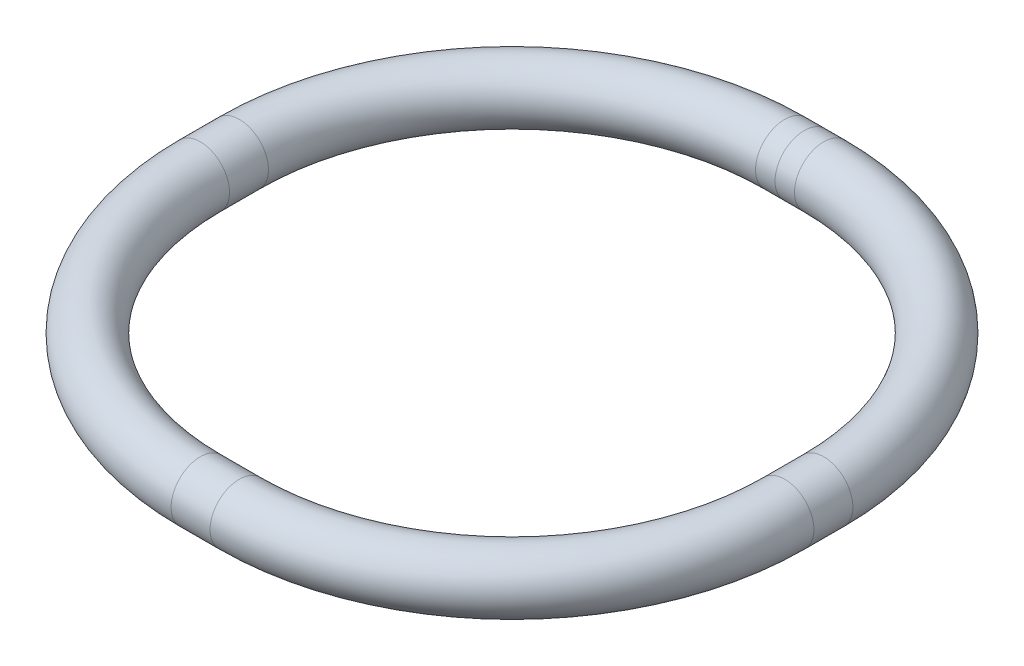
ISO-10303-21;
HEADER;
FILE_DESCRIPTION(('STEP AP214'),'2;1');
FILE_NAME('part.step','',(''),(''),'','','');
FILE_SCHEMA(('AUTOMOTIVE_DESIGN { 1 0 10303 214 1 1 1 1 }'));
ENDSEC;
DATA;
#1=APPLICATION_CONTEXT('core data for automotive mechanical design processes');
#2=APPLICATION_PROTOCOL_DEFINITION('international standard','automotive_design',2000,#1);
#3=PRODUCT_CONTEXT('',#1,'mechanical');
#4=PRODUCT('Part','Part','',(#3));
#5=PRODUCT_RELATED_PRODUCT_CATEGORY('part','',(#4));
#6=PRODUCT_DEFINITION_FORMATION('','',#4);
#7=PRODUCT_DEFINITION_CONTEXT('part definition',#1,'design');
#8=PRODUCT_DEFINITION('design','',#6,#7);
#9=PRODUCT_DEFINITION_SHAPE('','',#8);
#10=(LENGTH_UNIT() NAMED_UNIT(*) SI_UNIT(.MILLI.,.METRE.));
#11=(NAMED_UNIT(*) PLANE_ANGLE_UNIT() SI_UNIT($,.RADIAN.));
#12=(NAMED_UNIT(*) SI_UNIT($,.STERADIAN.) SOLID_ANGLE_UNIT());
#13=UNCERTAINTY_MEASURE_WITH_UNIT(LENGTH_MEASURE(1.E-05),#10,'distance_accuracy_value','');
#14=(GEOMETRIC_REPRESENTATION_CONTEXT(3) GLOBAL_UNCERTAINTY_ASSIGNED_CONTEXT((#13)) GLOBAL_UNIT_ASSIGNED_CONTEXT((#10,
#11,#12)) REPRESENTATION_CONTEXT('',''));
#15=CARTESIAN_POINT('',(0.,0.,0.));
#16=DIRECTION('',(0.,0.,1.));
#17=DIRECTION('',(1.,0.,0.));
#18=AXIS2_PLACEMENT_3D('',#15,#16,#17);
#19=CARTESIAN_POINT('',(-0.499999999999951,0.,-7.5));
#20=DIRECTION('',(1.,0.,0.));
#21=DIRECTION('',(0.,0.,-1.));
#22=AXIS2_PLACEMENT_3D('',#19,#20,#21);
#23=CYLINDRICAL_SURFACE('',#22,0.75);
#24=CARTESIAN_POINT('',(0.,0.,-7.5));
#25=DIRECTION('',(1.,0.,0.));
#26=DIRECTION('',(0.,0.,-1.));
#27=AXIS2_PLACEMENT_3D('',#24,#25,#26);
#28=CIRCLE('',#27,0.75);
#29=CARTESIAN_POINT('',(0.,0.,-8.25));
#30=VERTEX_POINT('',#29);
#31=EDGE_CURVE('E71',#30,#30,#28,.T.);
#32=ORIENTED_EDGE('',*,*,#31,.F.);
#33=EDGE_LOOP('',(#32));
#34=FACE_BOUND('',#33,.T.);
#35=CARTESIAN_POINT('',(-0.5,0.,-7.5));
#36=DIRECTION('',(1.,0.,0.));
#37=DIRECTION('',(0.,0.,-1.));
#38=AXIS2_PLACEMENT_3D('',#35,#36,#37);
#39=CIRCLE('',#38,0.75);
#40=CARTESIAN_POINT('',(-0.5,0.,-8.25));
#41=VERTEX_POINT('',#40);
#42=EDGE_CURVE('E10',#41,#41,#39,.T.);
#43=ORIENTED_EDGE('',*,*,#42,.T.);
#44=EDGE_LOOP('',(#43));
#45=FACE_BOUND('',#44,.T.);
#46=ADVANCED_FACE('F40',(#34,#45),#23,.T.);
#47=CARTESIAN_POINT('',(-0.5,0.,-0.5));
#48=DIRECTION('',(0.,-1.,0.));
#49=DIRECTION('',(0.,0.,-1.));
#50=AXIS2_PLACEMENT_3D('',#47,#48,#49);
#51=TOROIDAL_SURFACE('',#50,7.,0.75);
#52=CARTESIAN_POINT('',(-7.5,0.,-0.499999999999949));
#53=DIRECTION('',(0.,0.,-1.));
#54=DIRECTION('',(-1.,0.,0.));
#55=AXIS2_PLACEMENT_3D('',#52,#53,#54);
#56=CIRCLE('',#55,0.75);
#57=CARTESIAN_POINT('',(-8.25,0.,-0.499999999999944));
#58=VERTEX_POINT('',#57);
#59=EDGE_CURVE('E46',#58,#58,#56,.T.);
#60=CARTESIAN_POINT('',(-0.5,0.,-0.5));
#61=DIRECTION('',(0.,-1.,0.));
#62=DIRECTION('',(0.,0.,-1.));
#63=AXIS2_PLACEMENT_3D('',#60,#61,#62);
#64=CIRCLE('',#63,7.75);
#65=EDGE_CURVE('',#58,#41,#64,.T.);
#66=ORIENTED_EDGE('',*,*,#59,.T.);
#67=ORIENTED_EDGE('',*,*,#42,.F.);
#68=ORIENTED_EDGE('',*,*,#65,.T.);
#69=ORIENTED_EDGE('',*,*,#65,.F.);
#70=EDGE_LOOP('',(#66,#68,#67,#69));
#71=FACE_BOUND('',#70,.T.);
#72=ADVANCED_FACE('F78',(#71),#51,.T.);
#73=CARTESIAN_POINT('',(-7.5,0.,0.49999999999995));
#74=DIRECTION('',(0.,0.,-1.));
#75=DIRECTION('',(-1.,0.,0.));
#76=AXIS2_PLACEMENT_3D('',#73,#74,#75);
#77=CYLINDRICAL_SURFACE('',#76,0.75);
#78=ORIENTED_EDGE('',*,*,#59,.F.);
#79=EDGE_LOOP('',(#78));
#80=FACE_BOUND('',#79,.T.);
#81=CARTESIAN_POINT('',(-7.5,0.,0.499999999999952));
#82=DIRECTION('',(0.,0.,-1.));
#83=DIRECTION('',(-1.,0.,0.));
#84=AXIS2_PLACEMENT_3D('',#81,#82,#83);
#85=CIRCLE('',#84,0.75);
#86=CARTESIAN_POINT('',(-8.25,0.,0.499999999999947));
#87=VERTEX_POINT('',#86);
#88=EDGE_CURVE('E50',#87,#87,#85,.T.);
#89=ORIENTED_EDGE('',*,*,#88,.T.);
#90=EDGE_LOOP('',(#89));
#91=FACE_BOUND('',#90,.T.);
#92=ADVANCED_FACE('F82',(#80,#91),#77,.T.);
#93=CARTESIAN_POINT('',(-0.5,0.,0.5));
#94=DIRECTION('',(0.,-1.,0.));
#95=DIRECTION('',(0.,0.,-1.));
#96=AXIS2_PLACEMENT_3D('',#93,#94,#95);
#97=TOROIDAL_SURFACE('',#96,7.,0.75);
#98=CARTESIAN_POINT('',(-0.499999999999952,0.,7.5));
#99=DIRECTION('',(-1.,0.,0.));
#100=DIRECTION('',(0.,0.,1.));
#101=AXIS2_PLACEMENT_3D('',#98,#99,#100);
#102=CIRCLE('',#101,0.75);
#103=CARTESIAN_POINT('',(-0.499999999999946,0.,8.25));
#104=VERTEX_POINT('',#103);
#105=EDGE_CURVE('E54',#104,#104,#102,.T.);
#106=CARTESIAN_POINT('',(-0.5,0.,0.5));
#107=DIRECTION('',(0.,-1.,0.));
#108=DIRECTION('',(0.,0.,-1.));
#109=AXIS2_PLACEMENT_3D('',#106,#107,#108);
#110=CIRCLE('',#109,7.75);
#111=EDGE_CURVE('',#104,#87,#110,.T.);
#112=ORIENTED_EDGE('',*,*,#105,.T.);
#113=ORIENTED_EDGE('',*,*,#88,.F.);
#114=ORIENTED_EDGE('',*,*,#111,.T.);
#115=ORIENTED_EDGE('',*,*,#111,.F.);
#116=EDGE_LOOP('',(#112,#114,#113,#115));
#117=FACE_BOUND('',#116,.T.);
#118=ADVANCED_FACE('F87',(#117),#97,.T.);
#119=CARTESIAN_POINT('',(0.499999999999951,0.,7.5));
#120=DIRECTION('',(-1.,0.,0.));
#121=DIRECTION('',(0.,0.,1.));
#122=AXIS2_PLACEMENT_3D('',#119,#120,#121);
#123=CYLINDRICAL_SURFACE('',#122,0.75);
#124=ORIENTED_EDGE('',*,*,#105,.F.);
#125=EDGE_LOOP('',(#124));
#126=FACE_BOUND('',#125,.T.);
#127=CARTESIAN_POINT('',(0.5,0.,7.5));
#128=DIRECTION('',(-1.,0.,0.));
#129=DIRECTION('',(0.,0.,1.));
#130=AXIS2_PLACEMENT_3D('',#127,#128,#129);
#131=CIRCLE('',#130,0.75);
#132=CARTESIAN_POINT('',(0.5,0.,8.25));
#133=VERTEX_POINT('',#132);
#134=EDGE_CURVE('E59',#133,#133,#131,.T.);
#135=ORIENTED_EDGE('',*,*,#134,.T.);
#136=EDGE_LOOP('',(#135));
#137=FACE_BOUND('',#136,.T.);
#138=ADVANCED_FACE('F93',(#126,#137),#123,.T.);
#139=CARTESIAN_POINT('',(0.5,0.,0.5));
#140=DIRECTION('',(0.,-1.,0.));
#141=DIRECTION('',(0.,0.,-1.));
#142=AXIS2_PLACEMENT_3D('',#139,#140,#141);
#143=TOROIDAL_SURFACE('',#142,7.,0.75);
#144=CARTESIAN_POINT('',(7.5,0.,0.499999999999951));
#145=DIRECTION('',(0.,0.,1.));
#146=DIRECTION('',(1.,0.,0.));
#147=AXIS2_PLACEMENT_3D('',#144,#145,#146);
#148=CIRCLE('',#147,0.75);
#149=CARTESIAN_POINT('',(8.25,0.,0.499999999999946));
#150=VERTEX_POINT('',#149);
#151=EDGE_CURVE('E62',#150,#150,#148,.T.);
#152=CARTESIAN_POINT('',(0.5,0.,0.5));
#153=DIRECTION('',(0.,-1.,0.));
#154=DIRECTION('',(0.,0.,-1.));
#155=AXIS2_PLACEMENT_3D('',#152,#153,#154);
#156=CIRCLE('',#155,7.75);
#157=EDGE_CURVE('',#150,#133,#156,.T.);
#158=ORIENTED_EDGE('',*,*,#151,.T.);
#159=ORIENTED_EDGE('',*,*,#134,.F.);
#160=ORIENTED_EDGE('',*,*,#157,.T.);
#161=ORIENTED_EDGE('',*,*,#157,.F.);
#162=EDGE_LOOP('',(#158,#160,#159,#161));
#163=FACE_BOUND('',#162,.T.);
#164=ADVANCED_FACE('F97',(#163),#143,.T.);
#165=CARTESIAN_POINT('',(7.5,0.,-0.49999999999995));
#166=DIRECTION('',(0.,0.,1.));
#167=DIRECTION('',(1.,0.,0.));
#168=AXIS2_PLACEMENT_3D('',#165,#166,#167);
#169=CYLINDRICAL_SURFACE('',#168,0.75);
#170=ORIENTED_EDGE('',*,*,#151,.F.);
#171=EDGE_LOOP('',(#170));
#172=FACE_BOUND('',#171,.T.);
#173=CARTESIAN_POINT('',(7.5,0.,-0.499999999999952));
#174=DIRECTION('',(0.,0.,1.));
#175=DIRECTION('',(1.,0.,0.));
#176=AXIS2_PLACEMENT_3D('',#173,#174,#175);
#177=CIRCLE('',#176,0.75);
#178=CARTESIAN_POINT('',(8.25,0.,-0.499999999999947));
#179=VERTEX_POINT('',#178);
#180=EDGE_CURVE('E65',#179,#179,#177,.T.);
#181=ORIENTED_EDGE('',*,*,#180,.T.);
#182=EDGE_LOOP('',(#181));
#183=FACE_BOUND('',#182,.T.);
#184=ADVANCED_FACE('F101',(#172,#183),#169,.T.);
#185=CARTESIAN_POINT('',(0.5,0.,-0.5));
#186=DIRECTION('',(0.,-1.,0.));
#187=DIRECTION('',(0.,0.,-1.));
#188=AXIS2_PLACEMENT_3D('',#185,#186,#187);
#189=TOROIDAL_SURFACE('',#188,7.,0.75);
#190=CARTESIAN_POINT('',(0.499999999999955,0.,-7.5));
#191=DIRECTION('',(1.,0.,0.));
#192=DIRECTION('',(0.,0.,-1.));
#193=AXIS2_PLACEMENT_3D('',#190,#191,#192);
#194=CIRCLE('',#193,0.75);
#195=CARTESIAN_POINT('',(0.49999999999995,0.,-8.25));
#196=VERTEX_POINT('',#195);
#197=EDGE_CURVE('E68',#196,#196,#194,.T.);
#198=CARTESIAN_POINT('',(0.5,0.,-0.5));
#199=DIRECTION('',(0.,-1.,0.));
#200=DIRECTION('',(0.,0.,-1.));
#201=AXIS2_PLACEMENT_3D('',#198,#199,#200);
#202=CIRCLE('',#201,7.75);
#203=EDGE_CURVE('',#196,#179,#202,.T.);
#204=ORIENTED_EDGE('',*,*,#197,.T.);
#205=ORIENTED_EDGE('',*,*,#180,.F.);
#206=ORIENTED_EDGE('',*,*,#203,.T.);
#207=ORIENTED_EDGE('',*,*,#203,.F.);
#208=EDGE_LOOP('',(#204,#206,#205,#207));
#209=FACE_BOUND('',#208,.T.);
#210=ADVANCED_FACE('F105',(#209),#189,.T.);
#211=CARTESIAN_POINT('',(0.,0.,-7.5));
#212=DIRECTION('',(1.,0.,0.));
#213=DIRECTION('',(0.,0.,-1.));
#214=AXIS2_PLACEMENT_3D('',#211,#212,#213);
#215=CYLINDRICAL_SURFACE('',#214,0.75);
#216=ORIENTED_EDGE('',*,*,#197,.F.);
#217=EDGE_LOOP('',(#216));
#218=FACE_BOUND('',#217,.T.);
#219=ORIENTED_EDGE('',*,*,#31,.T.);
#220=EDGE_LOOP('',(#219));
#221=FACE_BOUND('',#220,.T.);
#222=ADVANCED_FACE('F75',(#218,#221),#215,.T.);
#223=CLOSED_SHELL('',(#46,#72,#92,#118,#138,#164,#184,#210,#222));
#224=MANIFOLD_SOLID_BREP('B2',#223);
#225=ADVANCED_BREP_SHAPE_REPRESENTATION('',(#18,#224),#14);
#226=SHAPE_DEFINITION_REPRESENTATION(#9,#225);
ENDSEC;
END-ISO-10303-21;
